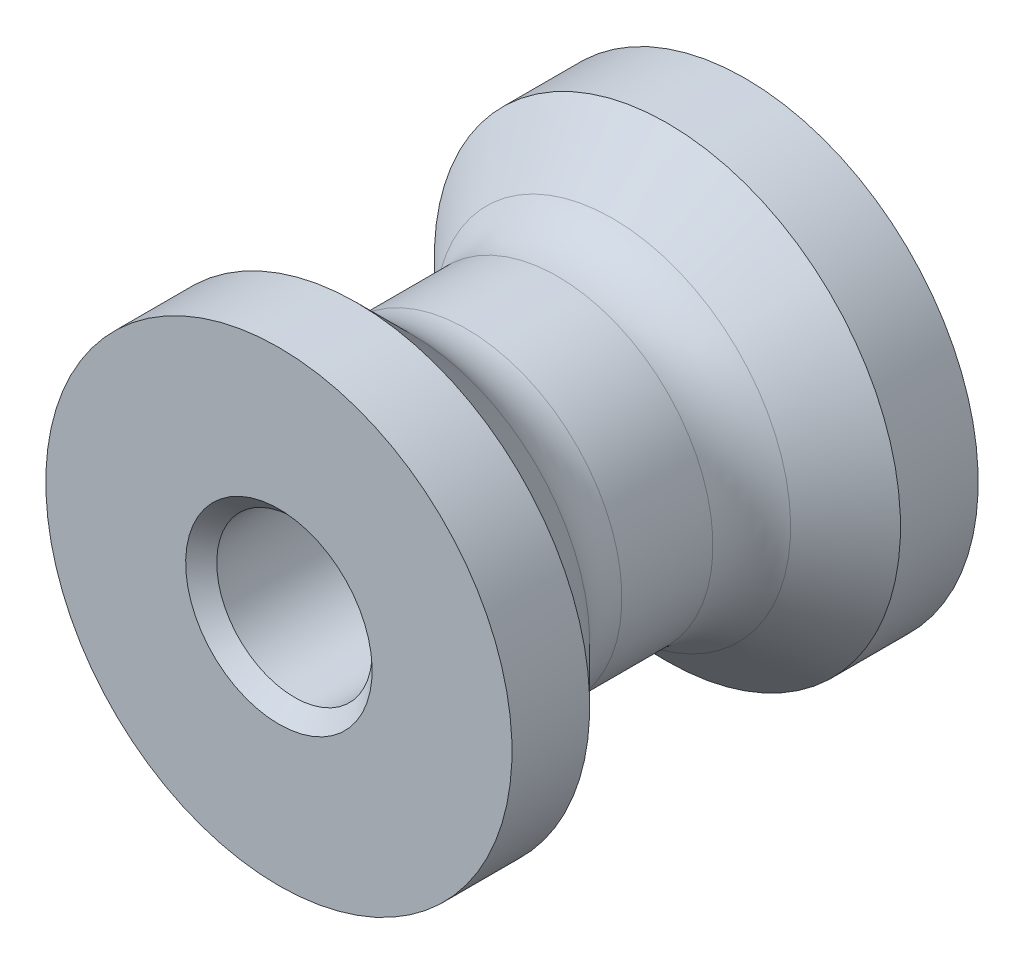
ISO-10303-21;
HEADER;
FILE_DESCRIPTION(('STEP AP214'),'2;1');
FILE_NAME('part.step','',(''),(''),'','','');
FILE_SCHEMA(('AUTOMOTIVE_DESIGN { 1 0 10303 214 1 1 1 1 }'));
ENDSEC;
DATA;
#1=APPLICATION_CONTEXT('core data for automotive mechanical design processes');
#2=APPLICATION_PROTOCOL_DEFINITION('international standard','automotive_design',2000,#1);
#3=PRODUCT_CONTEXT('',#1,'mechanical');
#4=PRODUCT('Part','Part','',(#3));
#5=PRODUCT_RELATED_PRODUCT_CATEGORY('part','',(#4));
#6=PRODUCT_DEFINITION_FORMATION('','',#4);
#7=PRODUCT_DEFINITION_CONTEXT('part definition',#1,'design');
#8=PRODUCT_DEFINITION('design','',#6,#7);
#9=PRODUCT_DEFINITION_SHAPE('','',#8);
#10=(LENGTH_UNIT() NAMED_UNIT(*) SI_UNIT(.MILLI.,.METRE.));
#11=(NAMED_UNIT(*) PLANE_ANGLE_UNIT() SI_UNIT($,.RADIAN.));
#12=(NAMED_UNIT(*) SI_UNIT($,.STERADIAN.) SOLID_ANGLE_UNIT());
#13=UNCERTAINTY_MEASURE_WITH_UNIT(LENGTH_MEASURE(1.E-05),#10,'distance_accuracy_value','');
#14=(GEOMETRIC_REPRESENTATION_CONTEXT(3) GLOBAL_UNCERTAINTY_ASSIGNED_CONTEXT((#13)) GLOBAL_UNIT_ASSIGNED_CONTEXT((#10,
#11,#12)) REPRESENTATION_CONTEXT('',''));
#15=CARTESIAN_POINT('',(0.,0.,0.));
#16=DIRECTION('',(0.,0.,1.));
#17=DIRECTION('',(1.,0.,0.));
#18=AXIS2_PLACEMENT_3D('',#15,#16,#17);
#19=CARTESIAN_POINT('',(0.,0.,-9.525));
#20=DIRECTION('',(0.,0.,-1.));
#21=DIRECTION('',(0.,1.,0.));
#22=AXIS2_PLACEMENT_3D('',#19,#20,#21);
#23=CYLINDRICAL_SURFACE('',#22,6.35);
#24=CARTESIAN_POINT('',(0.,0.,-11.3848719394654));
#25=DIRECTION('',(0.,0.,-1.));
#26=DIRECTION('',(-1.,0.,0.));
#27=AXIS2_PLACEMENT_3D('',#24,#25,#26);
#28=CIRCLE('',#27,6.35);
#29=CARTESIAN_POINT('',(-6.35,0.,-11.3848719394654));
#30=VERTEX_POINT('',#29);
#31=EDGE_CURVE('E73',#30,#30,#28,.F.);
#32=ORIENTED_EDGE('',*,*,#31,.T.);
#33=EDGE_LOOP('',(#32));
#34=FACE_BOUND('',#33,.T.);
#35=CARTESIAN_POINT('',(0.,0.,-7.66512806053458));
#36=DIRECTION('',(0.,0.,-1.));
#37=DIRECTION('',(-1.,0.,0.));
#38=AXIS2_PLACEMENT_3D('',#35,#36,#37);
#39=CIRCLE('',#38,6.35);
#40=CARTESIAN_POINT('',(-6.35,0.,-7.66512806053458));
#41=VERTEX_POINT('',#40);
#42=EDGE_CURVE('E53',#41,#41,#39,.T.);
#43=ORIENTED_EDGE('',*,*,#42,.T.);
#44=EDGE_LOOP('',(#43));
#45=FACE_BOUND('',#44,.T.);
#46=ADVANCED_FACE('F16',(#34,#45),#23,.T.);
#47=CARTESIAN_POINT('',(0.,0.,-11.3848719394654));
#48=DIRECTION('',(0.,0.,-1.));
#49=DIRECTION('',(-1.,0.,0.));
#50=AXIS2_PLACEMENT_3D('',#47,#48,#49);
#51=TOROIDAL_SURFACE('',#50,9.525,3.175);
#52=CARTESIAN_POINT('',(0.,0.,-13.6299359697344));
#53=DIRECTION('',(0.,0.,-1.));
#54=DIRECTION('',(0.,1.,0.));
#55=AXIS2_PLACEMENT_3D('',#52,#53,#54);
#56=CIRCLE('',#55,7.27993596973103);
#57=CARTESIAN_POINT('',(0.,7.27993596973103,-13.6299359697344));
#58=VERTEX_POINT('',#57);
#59=EDGE_CURVE('E48',#58,#58,#56,.T.);
#60=ORIENTED_EDGE('',*,*,#59,.F.);
#61=EDGE_LOOP('',(#60));
#62=FACE_BOUND('',#61,.T.);
#63=ORIENTED_EDGE('',*,*,#31,.F.);
#64=EDGE_LOOP('',(#63));
#65=FACE_BOUND('',#64,.T.);
#66=ADVANCED_FACE('F64',(#62,#65),#51,.F.);
#67=CARTESIAN_POINT('',(0.,0.,-7.66512806053458));
#68=DIRECTION('',(0.,0.,-1.));
#69=DIRECTION('',(-1.,0.,0.));
#70=AXIS2_PLACEMENT_3D('',#67,#68,#69);
#71=TOROIDAL_SURFACE('',#70,9.525,3.175);
#72=ORIENTED_EDGE('',*,*,#42,.F.);
#73=EDGE_LOOP('',(#72));
#74=FACE_BOUND('',#73,.T.);
#75=CARTESIAN_POINT('',(0.,0.,-5.4200640302656));
#76=DIRECTION('',(0.,0.,1.));
#77=DIRECTION('',(0.,1.,0.));
#78=AXIS2_PLACEMENT_3D('',#75,#76,#77);
#79=CIRCLE('',#78,7.27993596973104);
#80=CARTESIAN_POINT('',(0.,7.27993596973104,-5.4200640302656));
#81=VERTEX_POINT('',#80);
#82=EDGE_CURVE('E43',#81,#81,#79,.T.);
#83=ORIENTED_EDGE('',*,*,#82,.F.);
#84=EDGE_LOOP('',(#83));
#85=FACE_BOUND('',#84,.T.);
#86=ADVANCED_FACE('F60',(#74,#85),#71,.F.);
#87=CARTESIAN_POINT('',(0.,0.,-15.8749999999959));
#88=DIRECTION('',(0.,0.,-1.));
#89=DIRECTION('',(0.,1.,0.));
#90=AXIS2_PLACEMENT_3D('',#87,#88,#89);
#91=CONICAL_SURFACE('',#90,9.52500000000405,0.7853981634);
#92=ORIENTED_EDGE('',*,*,#59,.T.);
#93=EDGE_LOOP('',(#92));
#94=FACE_BOUND('',#93,.T.);
#95=CARTESIAN_POINT('',(0.,0.,-15.875));
#96=DIRECTION('',(0.,0.,-1.));
#97=DIRECTION('',(0.,1.,0.));
#98=AXIS2_PLACEMENT_3D('',#95,#96,#97);
#99=CIRCLE('',#98,9.525);
#100=CARTESIAN_POINT('',(0.,9.525,-15.875));
#101=VERTEX_POINT('',#100);
#102=EDGE_CURVE('E42',#101,#101,#99,.T.);
#103=ORIENTED_EDGE('',*,*,#102,.F.);
#104=EDGE_LOOP('',(#103));
#105=FACE_BOUND('',#104,.T.);
#106=ADVANCED_FACE('F63',(#94,#105),#91,.T.);
#107=CARTESIAN_POINT('',(0.,0.,-3.17500000000405));
#108=DIRECTION('',(0.,0.,1.));
#109=DIRECTION('',(0.,-1.,0.));
#110=AXIS2_PLACEMENT_3D('',#107,#108,#109);
#111=CONICAL_SURFACE('',#110,9.52500000000405,0.7853981634);
#112=ORIENTED_EDGE('',*,*,#82,.T.);
#113=EDGE_LOOP('',(#112));
#114=FACE_BOUND('',#113,.T.);
#115=CARTESIAN_POINT('',(0.,0.,-3.175));
#116=DIRECTION('',(0.,0.,-1.));
#117=DIRECTION('',(0.,1.,0.));
#118=AXIS2_PLACEMENT_3D('',#115,#116,#117);
#119=CIRCLE('',#118,9.525);
#120=CARTESIAN_POINT('',(0.,9.525,-3.175));
#121=VERTEX_POINT('',#120);
#122=EDGE_CURVE('E35',#121,#121,#119,.F.);
#123=ORIENTED_EDGE('',*,*,#122,.F.);
#124=EDGE_LOOP('',(#123));
#125=FACE_BOUND('',#124,.T.);
#126=ADVANCED_FACE('F101',(#114,#125),#111,.T.);
#127=CARTESIAN_POINT('',(0.,0.,-17.4625));
#128=DIRECTION('',(0.,0.,-1.));
#129=DIRECTION('',(0.,1.,0.));
#130=AXIS2_PLACEMENT_3D('',#127,#128,#129);
#131=CYLINDRICAL_SURFACE('',#130,9.525);
#132=CARTESIAN_POINT('',(0.,0.,-19.05));
#133=DIRECTION('',(0.,0.,-1.));
#134=DIRECTION('',(0.,1.,0.));
#135=AXIS2_PLACEMENT_3D('',#132,#133,#134);
#136=CIRCLE('',#135,9.525);
#137=CARTESIAN_POINT('',(0.,9.525,-19.05));
#138=VERTEX_POINT('',#137);
#139=EDGE_CURVE('E19',#138,#138,#136,.T.);
#140=ORIENTED_EDGE('',*,*,#139,.F.);
#141=EDGE_LOOP('',(#140));
#142=FACE_BOUND('',#141,.T.);
#143=ORIENTED_EDGE('',*,*,#102,.T.);
#144=EDGE_LOOP('',(#143));
#145=FACE_BOUND('',#144,.T.);
#146=ADVANCED_FACE('F98',(#142,#145),#131,.T.);
#147=CARTESIAN_POINT('',(0.,0.,-1.5875));
#148=DIRECTION('',(0.,0.,-1.));
#149=DIRECTION('',(0.,1.,0.));
#150=AXIS2_PLACEMENT_3D('',#147,#148,#149);
#151=CYLINDRICAL_SURFACE('',#150,9.525);
#152=ORIENTED_EDGE('',*,*,#122,.T.);
#153=EDGE_LOOP('',(#152));
#154=FACE_BOUND('',#153,.T.);
#155=CARTESIAN_POINT('',(0.,0.,0.));
#156=DIRECTION('',(0.,0.,-1.));
#157=DIRECTION('',(0.,1.,0.));
#158=AXIS2_PLACEMENT_3D('',#155,#156,#157);
#159=CIRCLE('',#158,9.525);
#160=CARTESIAN_POINT('',(0.,9.525,0.));
#161=VERTEX_POINT('',#160);
#162=EDGE_CURVE('E83',#161,#161,#159,.F.);
#163=ORIENTED_EDGE('',*,*,#162,.F.);
#164=EDGE_LOOP('',(#163));
#165=FACE_BOUND('',#164,.T.);
#166=ADVANCED_FACE('F131',(#154,#165),#151,.T.);
#167=CARTESIAN_POINT('',(0.,0.,-19.05));
#168=DIRECTION('',(0.,0.,-1.));
#169=DIRECTION('',(0.,1.,0.));
#170=AXIS2_PLACEMENT_3D('',#167,#168,#169);
#171=PLANE('',#170);
#172=CARTESIAN_POINT('',(0.,0.,-19.0499999999929));
#173=DIRECTION('',(0.,0.,-1.));
#174=DIRECTION('',(-1.,0.,0.));
#175=AXIS2_PLACEMENT_3D('',#172,#173,#174);
#176=CIRCLE('',#175,3.80999999993037);
#177=CARTESIAN_POINT('',(-3.80999999993037,0.,-19.0499999999929));
#178=VERTEX_POINT('',#177);
#179=EDGE_CURVE('E81',#178,#178,#176,.F.);
#180=ORIENTED_EDGE('',*,*,#179,.T.);
#181=EDGE_LOOP('',(#180));
#182=FACE_BOUND('',#181,.T.);
#183=ORIENTED_EDGE('',*,*,#139,.T.);
#184=EDGE_LOOP('',(#183));
#185=FACE_BOUND('',#184,.T.);
#186=ADVANCED_FACE('F127',(#182,#185),#171,.T.);
#187=CARTESIAN_POINT('',(0.,9.525,0.));
#188=DIRECTION('',(0.,0.,1.));
#189=DIRECTION('',(0.,-1.,0.));
#190=AXIS2_PLACEMENT_3D('',#187,#188,#189);
#191=PLANE('',#190);
#192=CARTESIAN_POINT('',(0.,0.,0.));
#193=DIRECTION('',(0.,0.,1.));
#194=DIRECTION('',(0.,-1.,0.));
#195=AXIS2_PLACEMENT_3D('',#192,#193,#194);
#196=CIRCLE('',#195,3.80999999998721);
#197=CARTESIAN_POINT('',(0.,-3.80999999998721,0.));
#198=VERTEX_POINT('',#197);
#199=EDGE_CURVE('E28',#198,#198,#196,.F.);
#200=ORIENTED_EDGE('',*,*,#199,.T.);
#201=EDGE_LOOP('',(#200));
#202=FACE_BOUND('',#201,.T.);
#203=ORIENTED_EDGE('',*,*,#162,.T.);
#204=EDGE_LOOP('',(#203));
#205=FACE_BOUND('',#204,.T.);
#206=ADVANCED_FACE('F123',(#202,#205),#191,.T.);
#207=CARTESIAN_POINT('',(0.,0.,-19.0499999999361));
#208=DIRECTION('',(0.,0.,-1.));
#209=DIRECTION('',(-1.,0.,0.));
#210=AXIS2_PLACEMENT_3D('',#207,#208,#209);
#211=CONICAL_SURFACE('',#210,3.80999999987353,0.785398163397448);
#212=ORIENTED_EDGE('',*,*,#179,.F.);
#213=EDGE_LOOP('',(#212));
#214=FACE_BOUND('',#213,.T.);
#215=CARTESIAN_POINT('',(0.,0.,-18.415));
#216=DIRECTION('',(0.,0.,1.));
#217=DIRECTION('',(0.,-1.,0.));
#218=AXIS2_PLACEMENT_3D('',#215,#216,#217);
#219=CIRCLE('',#218,3.175);
#220=CARTESIAN_POINT('',(0.,-3.175,-18.415));
#221=VERTEX_POINT('',#220);
#222=EDGE_CURVE('E23',#221,#221,#219,.T.);
#223=ORIENTED_EDGE('',*,*,#222,.T.);
#224=EDGE_LOOP('',(#223));
#225=FACE_BOUND('',#224,.T.);
#226=ADVANCED_FACE('F116',(#214,#225),#211,.F.);
#227=CARTESIAN_POINT('',(0.,0.,0.));
#228=DIRECTION('',(0.,0.,1.));
#229=DIRECTION('',(0.,-1.,0.));
#230=AXIS2_PLACEMENT_3D('',#227,#228,#229);
#231=CONICAL_SURFACE('',#230,3.80999999998721,0.78539816335269);
#232=ORIENTED_EDGE('',*,*,#199,.F.);
#233=EDGE_LOOP('',(#232));
#234=FACE_BOUND('',#233,.T.);
#235=CARTESIAN_POINT('',(0.,0.,-0.635000000000004));
#236=DIRECTION('',(0.,0.,1.));
#237=DIRECTION('',(0.,-1.,0.));
#238=AXIS2_PLACEMENT_3D('',#235,#236,#237);
#239=CIRCLE('',#238,3.175);
#240=CARTESIAN_POINT('',(0.,-3.175,-0.635000000000004));
#241=VERTEX_POINT('',#240);
#242=EDGE_CURVE('E10',#241,#241,#239,.F.);
#243=ORIENTED_EDGE('',*,*,#242,.T.);
#244=EDGE_LOOP('',(#243));
#245=FACE_BOUND('',#244,.T.);
#246=ADVANCED_FACE('F110',(#234,#245),#231,.F.);
#247=CARTESIAN_POINT('',(0.,0.,-19.05));
#248=DIRECTION('',(0.,0.,1.));
#249=DIRECTION('',(0.,-1.,0.));
#250=AXIS2_PLACEMENT_3D('',#247,#248,#249);
#251=CYLINDRICAL_SURFACE('',#250,3.175);
#252=ORIENTED_EDGE('',*,*,#242,.F.);
#253=EDGE_LOOP('',(#252));
#254=FACE_BOUND('',#253,.T.);
#255=ORIENTED_EDGE('',*,*,#222,.F.);
#256=EDGE_LOOP('',(#255));
#257=FACE_BOUND('',#256,.T.);
#258=ADVANCED_FACE('F108',(#254,#257),#251,.F.);
#259=CLOSED_SHELL('',(#46,#66,#86,#106,#126,#146,#166,#186,#206,#226,#246,#258));
#260=MANIFOLD_SOLID_BREP('B1',#259);
#261=ADVANCED_BREP_SHAPE_REPRESENTATION('',(#18,#260),#14);
#262=SHAPE_DEFINITION_REPRESENTATION(#9,#261);
ENDSEC;
END-ISO-10303-21;
